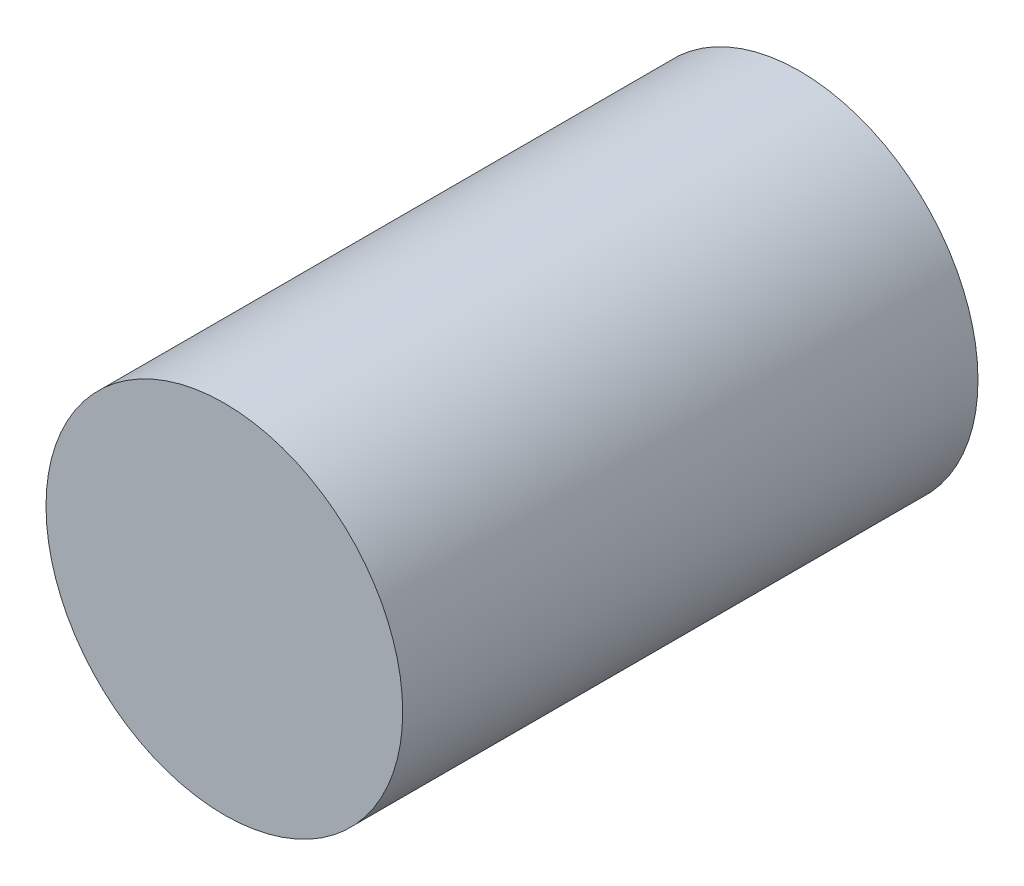
ISO-10303-21;
HEADER;
FILE_DESCRIPTION(('STEP AP214'),'2;1');
FILE_NAME('part.step','',(''),(''),'','','');
FILE_SCHEMA(('AUTOMOTIVE_DESIGN { 1 0 10303 214 1 1 1 1 }'));
ENDSEC;
DATA;
#1=APPLICATION_CONTEXT('core data for automotive mechanical design processes');
#2=APPLICATION_PROTOCOL_DEFINITION('international standard','automotive_design',2000,#1);
#3=PRODUCT_CONTEXT('',#1,'mechanical');
#4=PRODUCT('Part','Part','',(#3));
#5=PRODUCT_RELATED_PRODUCT_CATEGORY('part','',(#4));
#6=PRODUCT_DEFINITION_FORMATION('','',#4);
#7=PRODUCT_DEFINITION_CONTEXT('part definition',#1,'design');
#8=PRODUCT_DEFINITION('design','',#6,#7);
#9=PRODUCT_DEFINITION_SHAPE('','',#8);
#10=(LENGTH_UNIT() NAMED_UNIT(*) SI_UNIT(.MILLI.,.METRE.));
#11=(NAMED_UNIT(*) PLANE_ANGLE_UNIT() SI_UNIT($,.RADIAN.));
#12=(NAMED_UNIT(*) SI_UNIT($,.STERADIAN.) SOLID_ANGLE_UNIT());
#13=UNCERTAINTY_MEASURE_WITH_UNIT(LENGTH_MEASURE(1.E-05),#10,'distance_accuracy_value','');
#14=(GEOMETRIC_REPRESENTATION_CONTEXT(3) GLOBAL_UNCERTAINTY_ASSIGNED_CONTEXT((#13)) GLOBAL_UNIT_ASSIGNED_CONTEXT((#10,
#11,#12)) REPRESENTATION_CONTEXT('',''));
#15=CARTESIAN_POINT('',(0.,0.,0.));
#16=DIRECTION('',(0.,0.,1.));
#17=DIRECTION('',(1.,0.,0.));
#18=AXIS2_PLACEMENT_3D('',#15,#16,#17);
#19=CARTESIAN_POINT('',(0.,0.,50.));
#20=DIRECTION('',(0.,0.,-1.));
#21=DIRECTION('',(-1.,0.,0.));
#22=AXIS2_PLACEMENT_3D('',#19,#20,#21);
#23=CYLINDRICAL_SURFACE('',#22,15.5);
#24=CARTESIAN_POINT('',(0.,0.,50.));
#25=DIRECTION('',(0.,0.,1.));
#26=DIRECTION('',(1.,0.,0.));
#27=AXIS2_PLACEMENT_3D('',#24,#25,#26);
#28=CIRCLE('',#27,15.5);
#29=CARTESIAN_POINT('',(15.5,0.,50.));
#30=VERTEX_POINT('',#29);
#31=EDGE_CURVE('E10',#30,#30,#28,.T.);
#32=ORIENTED_EDGE('',*,*,#31,.F.);
#33=EDGE_LOOP('',(#32));
#34=FACE_BOUND('',#33,.T.);
#35=CARTESIAN_POINT('',(0.,0.,0.));
#36=DIRECTION('',(0.,0.,1.));
#37=DIRECTION('',(1.,0.,0.));
#38=AXIS2_PLACEMENT_3D('',#35,#36,#37);
#39=CIRCLE('',#38,15.5);
#40=CARTESIAN_POINT('',(15.5,0.,0.));
#41=VERTEX_POINT('',#40);
#42=EDGE_CURVE('E38',#41,#41,#39,.T.);
#43=ORIENTED_EDGE('',*,*,#42,.T.);
#44=EDGE_LOOP('',(#43));
#45=FACE_BOUND('',#44,.T.);
#46=ADVANCED_FACE('F35',(#34,#45),#23,.T.);
#47=CARTESIAN_POINT('',(0.,0.,50.));
#48=DIRECTION('',(0.,0.,1.));
#49=DIRECTION('',(1.,0.,0.));
#50=AXIS2_PLACEMENT_3D('',#47,#48,#49);
#51=PLANE('',#50);
#52=ORIENTED_EDGE('',*,*,#31,.T.);
#53=EDGE_LOOP('',(#52));
#54=FACE_BOUND('',#53,.T.);
#55=ADVANCED_FACE('F50',(#54),#51,.T.);
#56=CARTESIAN_POINT('',(0.,0.,0.));
#57=DIRECTION('',(0.,0.,1.));
#58=DIRECTION('',(1.,0.,0.));
#59=AXIS2_PLACEMENT_3D('',#56,#57,#58);
#60=PLANE('',#59);
#61=ORIENTED_EDGE('',*,*,#42,.F.);
#62=EDGE_LOOP('',(#61));
#63=FACE_BOUND('',#62,.T.);
#64=ADVANCED_FACE('F48',(#63),#60,.F.);
#65=CLOSED_SHELL('',(#46,#55,#64));
#66=MANIFOLD_SOLID_BREP('B2',#65);
#67=ADVANCED_BREP_SHAPE_REPRESENTATION('',(#18,#66),#14);
#68=SHAPE_DEFINITION_REPRESENTATION(#9,#67);
ENDSEC;
END-ISO-10303-21;
